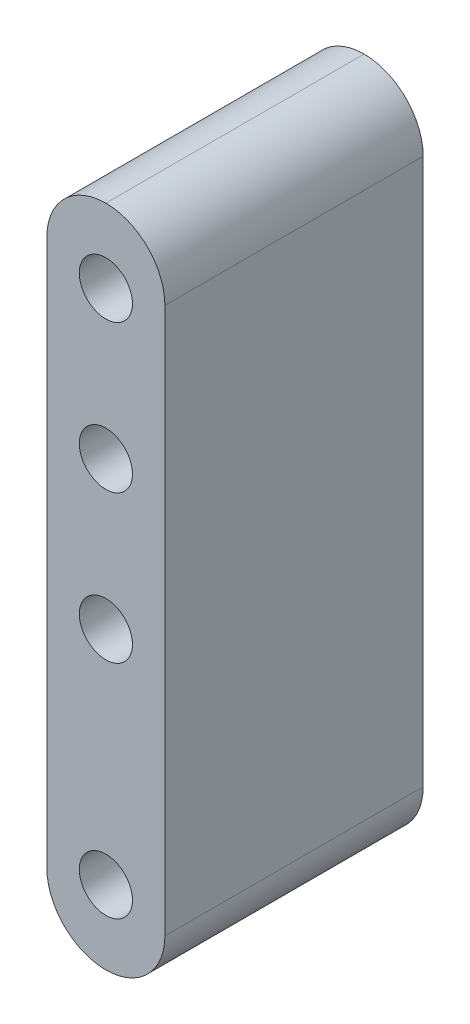
ISO-10303-21;
HEADER;
FILE_DESCRIPTION(('STEP AP214'),'2;1');
FILE_NAME('part.step','',(''),(''),'','','');
FILE_SCHEMA(('AUTOMOTIVE_DESIGN { 1 0 10303 214 1 1 1 1 }'));
ENDSEC;
DATA;
#1=APPLICATION_CONTEXT('core data for automotive mechanical design processes');
#2=APPLICATION_PROTOCOL_DEFINITION('international standard','automotive_design',2000,#1);
#3=PRODUCT_CONTEXT('',#1,'mechanical');
#4=PRODUCT('Part','Part','',(#3));
#5=PRODUCT_RELATED_PRODUCT_CATEGORY('part','',(#4));
#6=PRODUCT_DEFINITION_FORMATION('','',#4);
#7=PRODUCT_DEFINITION_CONTEXT('part definition',#1,'design');
#8=PRODUCT_DEFINITION('design','',#6,#7);
#9=PRODUCT_DEFINITION_SHAPE('','',#8);
#10=(LENGTH_UNIT() NAMED_UNIT(*) SI_UNIT(.MILLI.,.METRE.));
#11=(NAMED_UNIT(*) PLANE_ANGLE_UNIT() SI_UNIT($,.RADIAN.));
#12=(NAMED_UNIT(*) SI_UNIT($,.STERADIAN.) SOLID_ANGLE_UNIT());
#13=UNCERTAINTY_MEASURE_WITH_UNIT(LENGTH_MEASURE(1.E-05),#10,'distance_accuracy_value','');
#14=(GEOMETRIC_REPRESENTATION_CONTEXT(3) GLOBAL_UNCERTAINTY_ASSIGNED_CONTEXT((#13)) GLOBAL_UNIT_ASSIGNED_CONTEXT((#10,
#11,#12)) REPRESENTATION_CONTEXT('',''));
#15=CARTESIAN_POINT('',(0.,0.,0.));
#16=DIRECTION('',(0.,0.,1.));
#17=DIRECTION('',(1.,0.,0.));
#18=AXIS2_PLACEMENT_3D('',#15,#16,#17);
#19=CARTESIAN_POINT('',(0.,0.,22.225));
#20=DIRECTION('',(0.,0.,-1.));
#21=DIRECTION('',(-1.,0.,0.));
#22=AXIS2_PLACEMENT_3D('',#19,#20,#21);
#23=PLANE('',#22);
#24=CARTESIAN_POINT('',(5.08,5.08,22.225));
#25=DIRECTION('',(0.,0.,-1.));
#26=DIRECTION('',(-1.,0.,0.));
#27=AXIS2_PLACEMENT_3D('',#24,#25,#26);
#28=CIRCLE('',#27,5.08);
#29=CARTESIAN_POINT('',(0.,5.08,22.225));
#30=VERTEX_POINT('',#29);
#31=CARTESIAN_POINT('',(5.08,0.,22.225));
#32=VERTEX_POINT('',#31);
#33=EDGE_CURVE('E61',#30,#32,#28,.F.);
#34=ORIENTED_EDGE('',*,*,#33,.T.);
#35=CARTESIAN_POINT('',(5.08,5.08,22.225));
#36=DIRECTION('',(0.,0.,-1.));
#37=DIRECTION('',(-1.,0.,0.));
#38=AXIS2_PLACEMENT_3D('',#35,#36,#37);
#39=CIRCLE('',#38,5.08);
#40=CARTESIAN_POINT('',(10.16,5.08,22.225));
#41=VERTEX_POINT('',#40);
#42=EDGE_CURVE('E134',#32,#41,#39,.F.);
#43=ORIENTED_EDGE('',*,*,#42,.T.);
#44=DIRECTION('',(0.,1.,0.));
#45=VECTOR('',#44,1.);
#46=CARTESIAN_POINT('',(10.16,0.,22.225));
#47=LINE('',#46,#45);
#48=CARTESIAN_POINT('',(10.16,52.07,22.225));
#49=VERTEX_POINT('',#48);
#50=EDGE_CURVE('E109',#41,#49,#47,.T.);
#51=ORIENTED_EDGE('',*,*,#50,.T.);
#52=CARTESIAN_POINT('',(5.08,52.07,22.225));
#53=DIRECTION('',(0.,0.,-1.));
#54=DIRECTION('',(-1.,0.,0.));
#55=AXIS2_PLACEMENT_3D('',#52,#53,#54);
#56=CIRCLE('',#55,5.08);
#57=CARTESIAN_POINT('',(5.08,57.15,22.225));
#58=VERTEX_POINT('',#57);
#59=EDGE_CURVE('E54',#49,#58,#56,.F.);
#60=ORIENTED_EDGE('',*,*,#59,.T.);
#61=CARTESIAN_POINT('',(5.08,52.07,22.225));
#62=DIRECTION('',(0.,0.,-1.));
#63=DIRECTION('',(-1.,0.,0.));
#64=AXIS2_PLACEMENT_3D('',#61,#62,#63);
#65=CIRCLE('',#64,5.08);
#66=CARTESIAN_POINT('',(0.,52.07,22.225));
#67=VERTEX_POINT('',#66);
#68=EDGE_CURVE('E131',#58,#67,#65,.F.);
#69=ORIENTED_EDGE('',*,*,#68,.T.);
#70=DIRECTION('',(0.,-1.,0.));
#71=VECTOR('',#70,1.);
#72=CARTESIAN_POINT('',(0.,0.,22.225));
#73=LINE('',#72,#71);
#74=EDGE_CURVE('E116',#67,#30,#73,.T.);
#75=ORIENTED_EDGE('',*,*,#74,.T.);
#76=EDGE_LOOP('',(#34,#43,#51,#60,#69,#75));
#77=FACE_BOUND('',#76,.T.);
#78=CARTESIAN_POINT('',(5.08,6.35,22.225));
#79=DIRECTION('',(0.,0.,1.));
#80=DIRECTION('',(1.,0.,0.));
#81=AXIS2_PLACEMENT_3D('',#78,#79,#80);
#82=CIRCLE('',#81,2.286);
#83=CARTESIAN_POINT('',(7.366,6.35,22.225));
#84=VERTEX_POINT('',#83);
#85=EDGE_CURVE('E121',#84,#84,#82,.T.);
#86=ORIENTED_EDGE('',*,*,#85,.F.);
#87=EDGE_LOOP('',(#86));
#88=FACE_BOUND('',#87,.T.);
#89=CARTESIAN_POINT('',(5.08,25.4,22.225));
#90=DIRECTION('',(0.,0.,1.));
#91=DIRECTION('',(1.,0.,0.));
#92=AXIS2_PLACEMENT_3D('',#89,#90,#91);
#93=CIRCLE('',#92,2.286);
#94=CARTESIAN_POINT('',(7.366,25.4,22.225));
#95=VERTEX_POINT('',#94);
#96=EDGE_CURVE('E152',#95,#95,#93,.T.);
#97=ORIENTED_EDGE('',*,*,#96,.F.);
#98=EDGE_LOOP('',(#97));
#99=FACE_BOUND('',#98,.T.);
#100=CARTESIAN_POINT('',(5.07999999999996,38.1,22.225));
#101=DIRECTION('',(0.,0.,1.));
#102=DIRECTION('',(1.,0.,0.));
#103=AXIS2_PLACEMENT_3D('',#100,#101,#102);
#104=CIRCLE('',#103,2.286);
#105=CARTESIAN_POINT('',(7.36599999999996,38.1,22.225));
#106=VERTEX_POINT('',#105);
#107=EDGE_CURVE('E158',#106,#106,#104,.T.);
#108=ORIENTED_EDGE('',*,*,#107,.F.);
#109=EDGE_LOOP('',(#108));
#110=FACE_BOUND('',#109,.T.);
#111=CARTESIAN_POINT('',(5.07999999999991,50.8,22.225));
#112=DIRECTION('',(0.,0.,1.));
#113=DIRECTION('',(1.,0.,0.));
#114=AXIS2_PLACEMENT_3D('',#111,#112,#113);
#115=CIRCLE('',#114,2.286);
#116=CARTESIAN_POINT('',(7.36599999999991,50.8,22.225));
#117=VERTEX_POINT('',#116);
#118=EDGE_CURVE('E139',#117,#117,#115,.T.);
#119=ORIENTED_EDGE('',*,*,#118,.F.);
#120=EDGE_LOOP('',(#119));
#121=FACE_BOUND('',#120,.T.);
#122=ADVANCED_FACE('F37',(#77,#88,#99,#110,#121),#23,.F.);
#123=CARTESIAN_POINT('',(0.,0.,0.));
#124=DIRECTION('',(0.,0.,-1.));
#125=DIRECTION('',(-1.,0.,0.));
#126=AXIS2_PLACEMENT_3D('',#123,#124,#125);
#127=PLANE('',#126);
#128=CARTESIAN_POINT('',(5.07999999999996,38.1,0.));
#129=DIRECTION('',(0.,0.,1.));
#130=DIRECTION('',(1.,0.,0.));
#131=AXIS2_PLACEMENT_3D('',#128,#129,#130);
#132=CIRCLE('',#131,2.286);
#133=CARTESIAN_POINT('',(7.36599999999996,38.1,0.));
#134=VERTEX_POINT('',#133);
#135=EDGE_CURVE('E161',#134,#134,#132,.T.);
#136=ORIENTED_EDGE('',*,*,#135,.T.);
#137=EDGE_LOOP('',(#136));
#138=FACE_BOUND('',#137,.T.);
#139=CARTESIAN_POINT('',(5.08,6.35,0.));
#140=DIRECTION('',(0.,0.,1.));
#141=DIRECTION('',(1.,0.,0.));
#142=AXIS2_PLACEMENT_3D('',#139,#140,#141);
#143=CIRCLE('',#142,2.286);
#144=CARTESIAN_POINT('',(7.366,6.35,0.));
#145=VERTEX_POINT('',#144);
#146=EDGE_CURVE('E149',#145,#145,#143,.T.);
#147=ORIENTED_EDGE('',*,*,#146,.T.);
#148=EDGE_LOOP('',(#147));
#149=FACE_BOUND('',#148,.T.);
#150=DIRECTION('',(0.,1.,0.));
#151=VECTOR('',#150,1.);
#152=CARTESIAN_POINT('',(10.16,0.,0.));
#153=LINE('',#152,#151);
#154=CARTESIAN_POINT('',(10.16,5.08,0.));
#155=VERTEX_POINT('',#154);
#156=CARTESIAN_POINT('',(10.16,52.07,0.));
#157=VERTEX_POINT('',#156);
#158=EDGE_CURVE('E107',#155,#157,#153,.T.);
#159=ORIENTED_EDGE('',*,*,#158,.F.);
#160=CARTESIAN_POINT('',(5.08,5.08,0.));
#161=DIRECTION('',(0.,0.,-1.));
#162=DIRECTION('',(-1.,0.,0.));
#163=AXIS2_PLACEMENT_3D('',#160,#161,#162);
#164=CIRCLE('',#163,5.08);
#165=CARTESIAN_POINT('',(5.08,0.,0.));
#166=VERTEX_POINT('',#165);
#167=EDGE_CURVE('E92',#155,#166,#164,.T.);
#168=ORIENTED_EDGE('',*,*,#167,.T.);
#169=CARTESIAN_POINT('',(5.08,5.08,0.));
#170=DIRECTION('',(0.,0.,-1.));
#171=DIRECTION('',(-1.,0.,0.));
#172=AXIS2_PLACEMENT_3D('',#169,#170,#171);
#173=CIRCLE('',#172,5.08);
#174=CARTESIAN_POINT('',(0.,5.08,0.));
#175=VERTEX_POINT('',#174);
#176=EDGE_CURVE('E101',#166,#175,#173,.T.);
#177=ORIENTED_EDGE('',*,*,#176,.T.);
#178=DIRECTION('',(0.,-1.,0.));
#179=VECTOR('',#178,1.);
#180=CARTESIAN_POINT('',(0.,0.,0.));
#181=LINE('',#180,#179);
#182=CARTESIAN_POINT('',(0.,52.07,0.));
#183=VERTEX_POINT('',#182);
#184=EDGE_CURVE('E117',#183,#175,#181,.T.);
#185=ORIENTED_EDGE('',*,*,#184,.F.);
#186=CARTESIAN_POINT('',(5.08,52.07,0.));
#187=DIRECTION('',(0.,0.,-1.));
#188=DIRECTION('',(-1.,0.,0.));
#189=AXIS2_PLACEMENT_3D('',#186,#187,#188);
#190=CIRCLE('',#189,5.08);
#191=CARTESIAN_POINT('',(5.08,57.15,0.));
#192=VERTEX_POINT('',#191);
#193=EDGE_CURVE('E127',#183,#192,#190,.T.);
#194=ORIENTED_EDGE('',*,*,#193,.T.);
#195=CARTESIAN_POINT('',(5.08,52.07,0.));
#196=DIRECTION('',(0.,0.,-1.));
#197=DIRECTION('',(-1.,0.,0.));
#198=AXIS2_PLACEMENT_3D('',#195,#196,#197);
#199=CIRCLE('',#198,5.08);
#200=EDGE_CURVE('E110',#192,#157,#199,.T.);
#201=ORIENTED_EDGE('',*,*,#200,.T.);
#202=EDGE_LOOP('',(#159,#168,#177,#185,#194,#201));
#203=FACE_BOUND('',#202,.T.);
#204=CARTESIAN_POINT('',(5.08,25.4,0.));
#205=DIRECTION('',(0.,0.,1.));
#206=DIRECTION('',(1.,0.,0.));
#207=AXIS2_PLACEMENT_3D('',#204,#205,#206);
#208=CIRCLE('',#207,2.286);
#209=CARTESIAN_POINT('',(7.366,25.4,0.));
#210=VERTEX_POINT('',#209);
#211=EDGE_CURVE('E155',#210,#210,#208,.T.);
#212=ORIENTED_EDGE('',*,*,#211,.T.);
#213=EDGE_LOOP('',(#212));
#214=FACE_BOUND('',#213,.T.);
#215=CARTESIAN_POINT('',(5.07999999999991,50.8,0.));
#216=DIRECTION('',(0.,0.,1.));
#217=DIRECTION('',(1.,0.,0.));
#218=AXIS2_PLACEMENT_3D('',#215,#216,#217);
#219=CIRCLE('',#218,2.286);
#220=CARTESIAN_POINT('',(7.36599999999991,50.8,0.));
#221=VERTEX_POINT('',#220);
#222=EDGE_CURVE('E137',#221,#221,#219,.T.);
#223=ORIENTED_EDGE('',*,*,#222,.T.);
#224=EDGE_LOOP('',(#223));
#225=FACE_BOUND('',#224,.T.);
#226=ADVANCED_FACE('F113',(#138,#149,#203,#214,#225),#127,.T.);
#227=CARTESIAN_POINT('',(0.,0.,22.225));
#228=DIRECTION('',(1.,0.,0.));
#229=DIRECTION('',(0.,0.,-1.));
#230=AXIS2_PLACEMENT_3D('',#227,#228,#229);
#231=PLANE('',#230);
#232=ORIENTED_EDGE('',*,*,#184,.T.);
#233=DIRECTION('',(0.,0.,-1.));
#234=VECTOR('',#233,1.);
#235=CARTESIAN_POINT('',(0.,5.08,22.225));
#236=LINE('',#235,#234);
#237=EDGE_CURVE('E11',#175,#30,#236,.F.);
#238=ORIENTED_EDGE('',*,*,#237,.T.);
#239=ORIENTED_EDGE('',*,*,#74,.F.);
#240=DIRECTION('',(0.,0.,-1.));
#241=VECTOR('',#240,1.);
#242=CARTESIAN_POINT('',(0.,52.07,22.225));
#243=LINE('',#242,#241);
#244=EDGE_CURVE('E46',#67,#183,#243,.T.);
#245=ORIENTED_EDGE('',*,*,#244,.T.);
#246=EDGE_LOOP('',(#232,#238,#239,#245));
#247=FACE_BOUND('',#246,.T.);
#248=ADVANCED_FACE('F177',(#247),#231,.F.);
#249=CARTESIAN_POINT('',(10.16,0.,22.225));
#250=DIRECTION('',(-1.,0.,0.));
#251=DIRECTION('',(0.,0.,1.));
#252=AXIS2_PLACEMENT_3D('',#249,#250,#251);
#253=PLANE('',#252);
#254=ORIENTED_EDGE('',*,*,#50,.F.);
#255=DIRECTION('',(0.,0.,-1.));
#256=VECTOR('',#255,1.);
#257=CARTESIAN_POINT('',(10.16,5.08,22.225));
#258=LINE('',#257,#256);
#259=EDGE_CURVE('E96',#41,#155,#258,.T.);
#260=ORIENTED_EDGE('',*,*,#259,.T.);
#261=ORIENTED_EDGE('',*,*,#158,.T.);
#262=DIRECTION('',(0.,0.,-1.));
#263=VECTOR('',#262,1.);
#264=CARTESIAN_POINT('',(10.16,52.07,22.225));
#265=LINE('',#264,#263);
#266=EDGE_CURVE('E111',#157,#49,#265,.F.);
#267=ORIENTED_EDGE('',*,*,#266,.T.);
#268=EDGE_LOOP('',(#254,#260,#261,#267));
#269=FACE_BOUND('',#268,.T.);
#270=ADVANCED_FACE('F106',(#269),#253,.F.);
#271=CARTESIAN_POINT('',(5.08,6.35,22.225));
#272=DIRECTION('',(0.,0.,-1.));
#273=DIRECTION('',(-1.,0.,0.));
#274=AXIS2_PLACEMENT_3D('',#271,#272,#273);
#275=CYLINDRICAL_SURFACE('',#274,2.286);
#276=ORIENTED_EDGE('',*,*,#85,.T.);
#277=EDGE_LOOP('',(#276));
#278=FACE_BOUND('',#277,.T.);
#279=ORIENTED_EDGE('',*,*,#146,.F.);
#280=EDGE_LOOP('',(#279));
#281=FACE_BOUND('',#280,.T.);
#282=ADVANCED_FACE('F181',(#278,#281),#275,.F.);
#283=CARTESIAN_POINT('',(5.08,25.4,22.225));
#284=DIRECTION('',(0.,0.,-1.));
#285=DIRECTION('',(-1.,0.,0.));
#286=AXIS2_PLACEMENT_3D('',#283,#284,#285);
#287=CYLINDRICAL_SURFACE('',#286,2.286);
#288=ORIENTED_EDGE('',*,*,#96,.T.);
#289=EDGE_LOOP('',(#288));
#290=FACE_BOUND('',#289,.T.);
#291=ORIENTED_EDGE('',*,*,#211,.F.);
#292=EDGE_LOOP('',(#291));
#293=FACE_BOUND('',#292,.T.);
#294=ADVANCED_FACE('F222',(#290,#293),#287,.F.);
#295=CARTESIAN_POINT('',(5.07999999999996,38.1,22.225));
#296=DIRECTION('',(0.,0.,-1.));
#297=DIRECTION('',(-1.,0.,0.));
#298=AXIS2_PLACEMENT_3D('',#295,#296,#297);
#299=CYLINDRICAL_SURFACE('',#298,2.286);
#300=ORIENTED_EDGE('',*,*,#107,.T.);
#301=EDGE_LOOP('',(#300));
#302=FACE_BOUND('',#301,.T.);
#303=ORIENTED_EDGE('',*,*,#135,.F.);
#304=EDGE_LOOP('',(#303));
#305=FACE_BOUND('',#304,.T.);
#306=ADVANCED_FACE('F215',(#302,#305),#299,.F.);
#307=CARTESIAN_POINT('',(5.07999999999991,50.8,22.225));
#308=DIRECTION('',(0.,0.,-1.));
#309=DIRECTION('',(-1.,0.,0.));
#310=AXIS2_PLACEMENT_3D('',#307,#308,#309);
#311=CYLINDRICAL_SURFACE('',#310,2.286);
#312=ORIENTED_EDGE('',*,*,#118,.T.);
#313=EDGE_LOOP('',(#312));
#314=FACE_BOUND('',#313,.T.);
#315=ORIENTED_EDGE('',*,*,#222,.F.);
#316=EDGE_LOOP('',(#315));
#317=FACE_BOUND('',#316,.T.);
#318=ADVANCED_FACE('F169',(#314,#317),#311,.F.);
#319=CARTESIAN_POINT('',(5.08,5.08,22.225));
#320=DIRECTION('',(0.,0.,-1.));
#321=DIRECTION('',(-1.,0.,0.));
#322=AXIS2_PLACEMENT_3D('',#319,#320,#321);
#323=CYLINDRICAL_SURFACE('',#322,5.08);
#324=DIRECTION('',(0.,0.,-1.));
#325=VECTOR('',#324,1.);
#326=CARTESIAN_POINT('',(5.08,0.,22.225));
#327=LINE('',#326,#325);
#328=EDGE_CURVE('E97',#32,#166,#327,.T.);
#329=ORIENTED_EDGE('',*,*,#328,.F.);
#330=ORIENTED_EDGE('',*,*,#33,.F.);
#331=ORIENTED_EDGE('',*,*,#237,.F.);
#332=ORIENTED_EDGE('',*,*,#176,.F.);
#333=EDGE_LOOP('',(#329,#330,#331,#332));
#334=FACE_BOUND('',#333,.T.);
#335=ADVANCED_FACE('F191',(#334),#323,.T.);
#336=CARTESIAN_POINT('',(5.08,5.08,22.225));
#337=DIRECTION('',(0.,0.,-1.));
#338=DIRECTION('',(-1.,0.,0.));
#339=AXIS2_PLACEMENT_3D('',#336,#337,#338);
#340=CYLINDRICAL_SURFACE('',#339,5.08);
#341=ORIENTED_EDGE('',*,*,#42,.F.);
#342=ORIENTED_EDGE('',*,*,#328,.T.);
#343=ORIENTED_EDGE('',*,*,#167,.F.);
#344=ORIENTED_EDGE('',*,*,#259,.F.);
#345=EDGE_LOOP('',(#341,#342,#343,#344));
#346=FACE_BOUND('',#345,.T.);
#347=ADVANCED_FACE('F95',(#346),#340,.T.);
#348=CARTESIAN_POINT('',(5.08,52.07,22.225));
#349=DIRECTION('',(0.,0.,-1.));
#350=DIRECTION('',(-1.,0.,0.));
#351=AXIS2_PLACEMENT_3D('',#348,#349,#350);
#352=CYLINDRICAL_SURFACE('',#351,5.08);
#353=DIRECTION('',(0.,0.,-1.));
#354=VECTOR('',#353,1.);
#355=CARTESIAN_POINT('',(5.08,57.15,22.225));
#356=LINE('',#355,#354);
#357=EDGE_CURVE('E41',#58,#192,#356,.T.);
#358=ORIENTED_EDGE('',*,*,#357,.F.);
#359=ORIENTED_EDGE('',*,*,#59,.F.);
#360=ORIENTED_EDGE('',*,*,#266,.F.);
#361=ORIENTED_EDGE('',*,*,#200,.F.);
#362=EDGE_LOOP('',(#358,#359,#360,#361));
#363=FACE_BOUND('',#362,.T.);
#364=ADVANCED_FACE('F39',(#363),#352,.T.);
#365=CARTESIAN_POINT('',(5.08,52.07,22.225));
#366=DIRECTION('',(0.,0.,-1.));
#367=DIRECTION('',(-1.,0.,0.));
#368=AXIS2_PLACEMENT_3D('',#365,#366,#367);
#369=CYLINDRICAL_SURFACE('',#368,5.08);
#370=ORIENTED_EDGE('',*,*,#68,.F.);
#371=ORIENTED_EDGE('',*,*,#357,.T.);
#372=ORIENTED_EDGE('',*,*,#193,.F.);
#373=ORIENTED_EDGE('',*,*,#244,.F.);
#374=EDGE_LOOP('',(#370,#371,#372,#373));
#375=FACE_BOUND('',#374,.T.);
#376=ADVANCED_FACE('F144',(#375),#369,.T.);
#377=CLOSED_SHELL('',(#122,#226,#248,#270,#282,#294,#306,#318,#335,#347,#364,#376));
#378=MANIFOLD_SOLID_BREP('B2',#377);
#379=ADVANCED_BREP_SHAPE_REPRESENTATION('',(#18,#378),#14);
#380=SHAPE_DEFINITION_REPRESENTATION(#9,#379);
ENDSEC;
END-ISO-10303-21;
